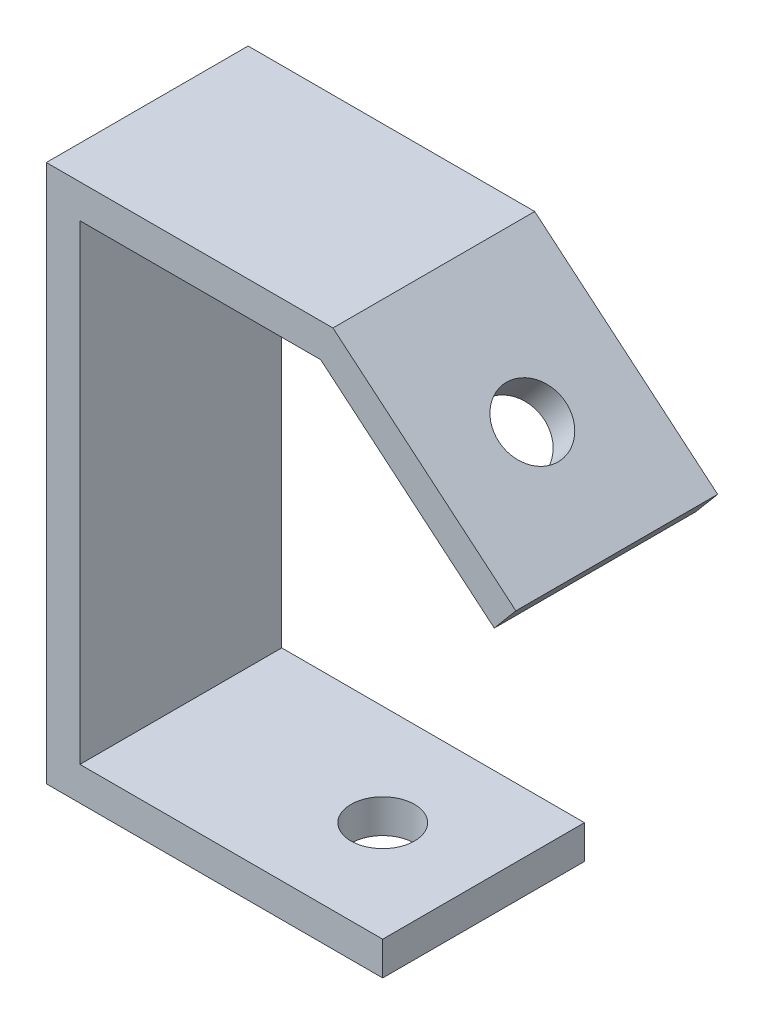
ISO-10303-21;
HEADER;
FILE_DESCRIPTION(('STEP AP214'),'2;1');
FILE_NAME('part.step','',(''),(''),'','','');
FILE_SCHEMA(('AUTOMOTIVE_DESIGN { 1 0 10303 214 1 1 1 1 }'));
ENDSEC;
DATA;
#1=APPLICATION_CONTEXT('core data for automotive mechanical design processes');
#2=APPLICATION_PROTOCOL_DEFINITION('international standard','automotive_design',2000,#1);
#3=PRODUCT_CONTEXT('',#1,'mechanical');
#4=PRODUCT('Part','Part','',(#3));
#5=PRODUCT_RELATED_PRODUCT_CATEGORY('part','',(#4));
#6=PRODUCT_DEFINITION_FORMATION('','',#4);
#7=PRODUCT_DEFINITION_CONTEXT('part definition',#1,'design');
#8=PRODUCT_DEFINITION('design','',#6,#7);
#9=PRODUCT_DEFINITION_SHAPE('','',#8);
#10=(LENGTH_UNIT() NAMED_UNIT(*) SI_UNIT(.MILLI.,.METRE.));
#11=(NAMED_UNIT(*) PLANE_ANGLE_UNIT() SI_UNIT($,.RADIAN.));
#12=(NAMED_UNIT(*) SI_UNIT($,.STERADIAN.) SOLID_ANGLE_UNIT());
#13=UNCERTAINTY_MEASURE_WITH_UNIT(LENGTH_MEASURE(1.E-05),#10,'distance_accuracy_value','');
#14=(GEOMETRIC_REPRESENTATION_CONTEXT(3) GLOBAL_UNCERTAINTY_ASSIGNED_CONTEXT((#13)) GLOBAL_UNIT_ASSIGNED_CONTEXT((#10,
#11,#12)) REPRESENTATION_CONTEXT('',''));
#15=CARTESIAN_POINT('',(0.,0.,0.));
#16=DIRECTION('',(0.,0.,1.));
#17=DIRECTION('',(1.,0.,0.));
#18=AXIS2_PLACEMENT_3D('',#15,#16,#17);
#19=CARTESIAN_POINT('',(0.,61.8433753685089,38.1));
#20=DIRECTION('',(1.,0.,0.));
#21=DIRECTION('',(0.,0.,-1.));
#22=AXIS2_PLACEMENT_3D('',#19,#20,#21);
#23=PLANE('',#22);
#24=DIRECTION('',(0.,-1.,0.));
#25=VECTOR('',#24,1.);
#26=CARTESIAN_POINT('',(0.,61.8433753685089,0.));
#27=LINE('',#26,#25);
#28=CARTESIAN_POINT('',(0.,61.8433753685089,0.));
#29=VERTEX_POINT('',#28);
#30=CARTESIAN_POINT('',(0.,-39.7566246314911,0.));
#31=VERTEX_POINT('',#30);
#32=EDGE_CURVE('E157',#29,#31,#27,.T.);
#33=ORIENTED_EDGE('',*,*,#32,.T.);
#34=DIRECTION('',(0.,0.,-1.));
#35=VECTOR('',#34,1.);
#36=CARTESIAN_POINT('',(0.,-39.7566246314911,38.1));
#37=LINE('',#36,#35);
#38=CARTESIAN_POINT('',(0.,-39.7566246314911,38.1));
#39=VERTEX_POINT('',#38);
#40=EDGE_CURVE('E11',#39,#31,#37,.T.);
#41=ORIENTED_EDGE('',*,*,#40,.F.);
#42=DIRECTION('',(0.,-1.,0.));
#43=VECTOR('',#42,1.);
#44=CARTESIAN_POINT('',(0.,61.8433753685089,38.1));
#45=LINE('',#44,#43);
#46=CARTESIAN_POINT('',(0.,61.8433753685089,38.1));
#47=VERTEX_POINT('',#46);
#48=EDGE_CURVE('E185',#47,#39,#45,.T.);
#49=ORIENTED_EDGE('',*,*,#48,.F.);
#50=DIRECTION('',(0.,0.,-1.));
#51=VECTOR('',#50,1.);
#52=CARTESIAN_POINT('',(0.,61.8433753685089,38.1));
#53=LINE('',#52,#51);
#54=EDGE_CURVE('E153',#47,#29,#53,.T.);
#55=ORIENTED_EDGE('',*,*,#54,.T.);
#56=EDGE_LOOP('',(#33,#41,#49,#55));
#57=FACE_BOUND('',#56,.T.);
#58=ADVANCED_FACE('F43',(#57),#23,.F.);
#59=CARTESIAN_POINT('',(0.,-39.7566246314911,38.1));
#60=DIRECTION('',(0.,1.,0.));
#61=DIRECTION('',(0.,0.,1.));
#62=AXIS2_PLACEMENT_3D('',#59,#60,#61);
#63=PLANE('',#62);
#64=CARTESIAN_POINT('',(44.47,-39.7566246314911,19.05));
#65=DIRECTION('',(0.,-1.,0.));
#66=DIRECTION('',(0.,0.,-1.));
#67=AXIS2_PLACEMENT_3D('',#64,#65,#66);
#68=CIRCLE('',#67,6.);
#69=CARTESIAN_POINT('',(44.47,-39.7566246314911,13.05));
#70=VERTEX_POINT('',#69);
#71=EDGE_CURVE('E248',#70,#70,#68,.T.);
#72=ORIENTED_EDGE('',*,*,#71,.F.);
#73=EDGE_LOOP('',(#72));
#74=FACE_BOUND('',#73,.T.);
#75=DIRECTION('',(1.,0.,0.));
#76=VECTOR('',#75,1.);
#77=CARTESIAN_POINT('',(0.,-39.7566246314911,0.));
#78=LINE('',#77,#76);
#79=CARTESIAN_POINT('',(63.51,-39.7566246314911,0.));
#80=VERTEX_POINT('',#79);
#81=EDGE_CURVE('E161',#31,#80,#78,.T.);
#82=ORIENTED_EDGE('',*,*,#81,.T.);
#83=DIRECTION('',(0.,0.,-1.));
#84=VECTOR('',#83,1.);
#85=CARTESIAN_POINT('',(63.51,-39.7566246314911,38.1));
#86=LINE('',#85,#84);
#87=CARTESIAN_POINT('',(63.51,-39.7566246314911,38.1));
#88=VERTEX_POINT('',#87);
#89=EDGE_CURVE('E53',#88,#80,#86,.T.);
#90=ORIENTED_EDGE('',*,*,#89,.F.);
#91=DIRECTION('',(1.,0.,0.));
#92=VECTOR('',#91,1.);
#93=CARTESIAN_POINT('',(0.,-39.7566246314911,38.1));
#94=LINE('',#93,#92);
#95=EDGE_CURVE('E110',#39,#88,#94,.T.);
#96=ORIENTED_EDGE('',*,*,#95,.F.);
#97=ORIENTED_EDGE('',*,*,#40,.T.);
#98=EDGE_LOOP('',(#82,#90,#96,#97));
#99=FACE_BOUND('',#98,.T.);
#100=ADVANCED_FACE('F275',(#74,#99),#63,.F.);
#101=CARTESIAN_POINT('',(63.51,-39.7566246314911,38.1));
#102=DIRECTION('',(-1.,0.,0.));
#103=DIRECTION('',(0.,0.,1.));
#104=AXIS2_PLACEMENT_3D('',#101,#102,#103);
#105=PLANE('',#104);
#106=DIRECTION('',(0.,1.,0.));
#107=VECTOR('',#106,1.);
#108=CARTESIAN_POINT('',(63.51,-39.7566246314911,0.));
#109=LINE('',#108,#107);
#110=CARTESIAN_POINT('',(63.51,-33.4066246314911,0.));
#111=VERTEX_POINT('',#110);
#112=EDGE_CURVE('E164',#80,#111,#109,.T.);
#113=ORIENTED_EDGE('',*,*,#112,.T.);
#114=DIRECTION('',(0.,0.,-1.));
#115=VECTOR('',#114,1.);
#116=CARTESIAN_POINT('',(63.51,-33.4066246314911,38.1));
#117=LINE('',#116,#115);
#118=CARTESIAN_POINT('',(63.51,-33.4066246314911,38.1));
#119=VERTEX_POINT('',#118);
#120=EDGE_CURVE('E204',#119,#111,#117,.T.);
#121=ORIENTED_EDGE('',*,*,#120,.F.);
#122=DIRECTION('',(0.,1.,0.));
#123=VECTOR('',#122,1.);
#124=CARTESIAN_POINT('',(63.51,-39.7566246314911,38.1));
#125=LINE('',#124,#123);
#126=EDGE_CURVE('E215',#88,#119,#125,.T.);
#127=ORIENTED_EDGE('',*,*,#126,.F.);
#128=ORIENTED_EDGE('',*,*,#89,.T.);
#129=EDGE_LOOP('',(#113,#121,#127,#128));
#130=FACE_BOUND('',#129,.T.);
#131=ADVANCED_FACE('F213',(#130),#105,.F.);
#132=CARTESIAN_POINT('',(63.51,-33.4066246314911,38.1));
#133=DIRECTION('',(0.,-1.,0.));
#134=DIRECTION('',(0.,0.,-1.));
#135=AXIS2_PLACEMENT_3D('',#132,#133,#134);
#136=PLANE('',#135);
#137=CARTESIAN_POINT('',(44.47,-33.4066246314911,19.05));
#138=DIRECTION('',(0.,-1.,0.));
#139=DIRECTION('',(0.,0.,-1.));
#140=AXIS2_PLACEMENT_3D('',#137,#138,#139);
#141=CIRCLE('',#140,6.);
#142=CARTESIAN_POINT('',(44.47,-33.4066246314911,13.05));
#143=VERTEX_POINT('',#142);
#144=EDGE_CURVE('E46',#143,#143,#141,.T.);
#145=ORIENTED_EDGE('',*,*,#144,.T.);
#146=EDGE_LOOP('',(#145));
#147=FACE_BOUND('',#146,.T.);
#148=DIRECTION('',(-1.,0.,0.));
#149=VECTOR('',#148,1.);
#150=CARTESIAN_POINT('',(63.51,-33.4066246314911,0.));
#151=LINE('',#150,#149);
#152=CARTESIAN_POINT('',(6.35,-33.4066246314911,0.));
#153=VERTEX_POINT('',#152);
#154=EDGE_CURVE('E167',#111,#153,#151,.T.);
#155=ORIENTED_EDGE('',*,*,#154,.T.);
#156=DIRECTION('',(0.,0.,-1.));
#157=VECTOR('',#156,1.);
#158=CARTESIAN_POINT('',(6.35,-33.4066246314911,38.1));
#159=LINE('',#158,#157);
#160=CARTESIAN_POINT('',(6.35,-33.4066246314911,38.1));
#161=VERTEX_POINT('',#160);
#162=EDGE_CURVE('E200',#161,#153,#159,.T.);
#163=ORIENTED_EDGE('',*,*,#162,.F.);
#164=DIRECTION('',(-1.,0.,0.));
#165=VECTOR('',#164,1.);
#166=CARTESIAN_POINT('',(63.51,-33.4066246314911,38.1));
#167=LINE('',#166,#165);
#168=EDGE_CURVE('E234',#119,#161,#167,.T.);
#169=ORIENTED_EDGE('',*,*,#168,.F.);
#170=ORIENTED_EDGE('',*,*,#120,.T.);
#171=EDGE_LOOP('',(#155,#163,#169,#170));
#172=FACE_BOUND('',#171,.T.);
#173=ADVANCED_FACE('F224',(#147,#172),#136,.F.);
#174=CARTESIAN_POINT('',(6.35,-33.4066246314911,38.1));
#175=DIRECTION('',(-1.,0.,0.));
#176=DIRECTION('',(0.,0.,1.));
#177=AXIS2_PLACEMENT_3D('',#174,#175,#176);
#178=PLANE('',#177);
#179=DIRECTION('',(0.,1.,0.));
#180=VECTOR('',#179,1.);
#181=CARTESIAN_POINT('',(6.35,-33.4066246314911,0.));
#182=LINE('',#181,#180);
#183=CARTESIAN_POINT('',(6.35,55.4933753685089,0.));
#184=VERTEX_POINT('',#183);
#185=EDGE_CURVE('E170',#153,#184,#182,.T.);
#186=ORIENTED_EDGE('',*,*,#185,.T.);
#187=DIRECTION('',(0.,0.,-1.));
#188=VECTOR('',#187,1.);
#189=CARTESIAN_POINT('',(6.35,55.4933753685089,38.1));
#190=LINE('',#189,#188);
#191=CARTESIAN_POINT('',(6.35,55.4933753685089,38.1));
#192=VERTEX_POINT('',#191);
#193=EDGE_CURVE('E196',#192,#184,#190,.T.);
#194=ORIENTED_EDGE('',*,*,#193,.F.);
#195=DIRECTION('',(0.,1.,0.));
#196=VECTOR('',#195,1.);
#197=CARTESIAN_POINT('',(6.35,-33.4066246314911,38.1));
#198=LINE('',#197,#196);
#199=EDGE_CURVE('E230',#161,#192,#198,.T.);
#200=ORIENTED_EDGE('',*,*,#199,.F.);
#201=ORIENTED_EDGE('',*,*,#162,.T.);
#202=EDGE_LOOP('',(#186,#194,#200,#201));
#203=FACE_BOUND('',#202,.T.);
#204=ADVANCED_FACE('F228',(#203),#178,.F.);
#205=CARTESIAN_POINT('',(6.35,55.4933753685089,38.1));
#206=DIRECTION('',(0.,1.,0.));
#207=DIRECTION('',(-1.,0.,0.));
#208=AXIS2_PLACEMENT_3D('',#205,#206,#207);
#209=PLANE('',#208);
#210=DIRECTION('',(1.,0.,0.));
#211=VECTOR('',#210,1.);
#212=CARTESIAN_POINT('',(6.35,55.4933753685089,0.));
#213=LINE('',#212,#211);
#214=CARTESIAN_POINT('',(51.8087890124096,55.4933753685089,0.));
#215=VERTEX_POINT('',#214);
#216=EDGE_CURVE('E173',#184,#215,#213,.T.);
#217=ORIENTED_EDGE('',*,*,#216,.T.);
#218=DIRECTION('',(0.,0.,-1.));
#219=VECTOR('',#218,1.);
#220=CARTESIAN_POINT('',(51.8087890124096,55.4933753685089,38.1));
#221=LINE('',#220,#219);
#222=CARTESIAN_POINT('',(51.8087890124096,55.4933753685089,38.1));
#223=VERTEX_POINT('',#222);
#224=EDGE_CURVE('E192',#223,#215,#221,.T.);
#225=ORIENTED_EDGE('',*,*,#224,.F.);
#226=DIRECTION('',(1.,0.,0.));
#227=VECTOR('',#226,1.);
#228=CARTESIAN_POINT('',(6.35,55.4933753685089,38.1));
#229=LINE('',#228,#227);
#230=EDGE_CURVE('E233',#192,#223,#229,.T.);
#231=ORIENTED_EDGE('',*,*,#230,.F.);
#232=ORIENTED_EDGE('',*,*,#193,.T.);
#233=EDGE_LOOP('',(#217,#225,#231,#232));
#234=FACE_BOUND('',#233,.T.);
#235=ADVANCED_FACE('F287',(#234),#209,.F.);
#236=CARTESIAN_POINT('',(51.8087890124096,55.4933753685089,38.1));
#237=DIRECTION('',(0.642787609686541,0.766044443118977,0.));
#238=DIRECTION('',(-0.766044443118977,0.642787609686541,0.));
#239=AXIS2_PLACEMENT_3D('',#236,#237,#238);
#240=PLANE('',#239);
#241=CARTESIAN_POINT('',(68.6378577574192,41.3721099915142,19.05));
#242=DIRECTION('',(0.642787609686541,0.766044443118977,0.));
#243=DIRECTION('',(-0.766044443118977,0.642787609686541,0.));
#244=AXIS2_PLACEMENT_3D('',#241,#242,#243);
#245=CIRCLE('',#244,6.35820536132282);
#246=CARTESIAN_POINT('',(63.7671898721686,45.4590856176151,19.05));
#247=VERTEX_POINT('',#246);
#248=EDGE_CURVE('E252',#247,#247,#245,.T.);
#249=ORIENTED_EDGE('',*,*,#248,.T.);
#250=EDGE_LOOP('',(#249));
#251=FACE_BOUND('',#250,.T.);
#252=DIRECTION('',(0.766044443118977,-0.642787609686541,0.));
#253=VECTOR('',#252,1.);
#254=CARTESIAN_POINT('',(51.8087890124096,55.4933753685089,0.));
#255=LINE('',#254,#253);
#256=CARTESIAN_POINT('',(84.5792426187251,27.9956998339373,0.));
#257=VERTEX_POINT('',#256);
#258=EDGE_CURVE('E176',#215,#257,#255,.T.);
#259=ORIENTED_EDGE('',*,*,#258,.T.);
#260=DIRECTION('',(0.,0.,-1.));
#261=VECTOR('',#260,1.);
#262=CARTESIAN_POINT('',(84.5792426187251,27.9956998339373,38.1));
#263=LINE('',#262,#261);
#264=CARTESIAN_POINT('',(84.5792426187251,27.9956998339373,38.1));
#265=VERTEX_POINT('',#264);
#266=EDGE_CURVE('E146',#265,#257,#263,.T.);
#267=ORIENTED_EDGE('',*,*,#266,.F.);
#268=DIRECTION('',(0.766044443118977,-0.642787609686541,0.));
#269=VECTOR('',#268,1.);
#270=CARTESIAN_POINT('',(51.8087890124096,55.4933753685089,38.1));
#271=LINE('',#270,#269);
#272=EDGE_CURVE('E135',#223,#265,#271,.T.);
#273=ORIENTED_EDGE('',*,*,#272,.F.);
#274=ORIENTED_EDGE('',*,*,#224,.T.);
#275=EDGE_LOOP('',(#259,#267,#273,#274));
#276=FACE_BOUND('',#275,.T.);
#277=ADVANCED_FACE('F272',(#251,#276),#240,.F.);
#278=CARTESIAN_POINT('',(88.6609439402347,32.8600820477428,38.1));
#279=DIRECTION('',(-0.766044443118977,0.64278760968654,0.));
#280=DIRECTION('',(-0.64278760968654,-0.766044443118977,0.));
#281=AXIS2_PLACEMENT_3D('',#278,#279,#280);
#282=PLANE('',#281);
#283=DIRECTION('',(0.64278760968654,0.766044443118977,0.));
#284=VECTOR('',#283,1.);
#285=CARTESIAN_POINT('',(88.6609439402347,32.8600820477428,0.));
#286=LINE('',#285,#284);
#287=CARTESIAN_POINT('',(88.6609439402347,32.8600820477428,0.));
#288=VERTEX_POINT('',#287);
#289=EDGE_CURVE('E144',#257,#288,#286,.T.);
#290=ORIENTED_EDGE('',*,*,#289,.T.);
#291=DIRECTION('',(0.,0.,-1.));
#292=VECTOR('',#291,1.);
#293=CARTESIAN_POINT('',(88.6609439402347,32.8600820477428,38.1));
#294=LINE('',#293,#292);
#295=CARTESIAN_POINT('',(88.6609439402347,32.8600820477428,38.1));
#296=VERTEX_POINT('',#295);
#297=EDGE_CURVE('E141',#296,#288,#294,.T.);
#298=ORIENTED_EDGE('',*,*,#297,.F.);
#299=DIRECTION('',(0.64278760968654,0.766044443118977,0.));
#300=VECTOR('',#299,1.);
#301=CARTESIAN_POINT('',(88.6609439402347,32.8600820477428,38.1));
#302=LINE('',#301,#300);
#303=EDGE_CURVE('E129',#265,#296,#302,.T.);
#304=ORIENTED_EDGE('',*,*,#303,.F.);
#305=ORIENTED_EDGE('',*,*,#266,.T.);
#306=EDGE_LOOP('',(#290,#298,#304,#305));
#307=FACE_BOUND('',#306,.T.);
#308=ADVANCED_FACE('F142',(#307),#282,.F.);
#309=CARTESIAN_POINT('',(54.12,61.8433753685089,38.1));
#310=DIRECTION('',(-0.642787609686541,-0.766044443118977,0.));
#311=DIRECTION('',(0.766044443118977,-0.642787609686541,0.));
#312=AXIS2_PLACEMENT_3D('',#309,#310,#311);
#313=PLANE('',#312);
#314=CARTESIAN_POINT('',(72.7195590789288,46.2364922053197,19.05));
#315=DIRECTION('',(0.642787609686541,0.766044443118977,0.));
#316=DIRECTION('',(-0.766044443118977,0.642787609686541,0.));
#317=AXIS2_PLACEMENT_3D('',#314,#315,#316);
#318=CIRCLE('',#317,6.35820536132282);
#319=CARTESIAN_POINT('',(67.8488911936781,50.3234678314206,19.05));
#320=VERTEX_POINT('',#319);
#321=EDGE_CURVE('E256',#320,#320,#318,.T.);
#322=ORIENTED_EDGE('',*,*,#321,.F.);
#323=EDGE_LOOP('',(#322));
#324=FACE_BOUND('',#323,.T.);
#325=DIRECTION('',(-0.766044443118977,0.642787609686541,0.));
#326=VECTOR('',#325,1.);
#327=CARTESIAN_POINT('',(54.12,61.8433753685089,0.));
#328=LINE('',#327,#326);
#329=CARTESIAN_POINT('',(54.12,61.8433753685089,0.));
#330=VERTEX_POINT('',#329);
#331=EDGE_CURVE('E96',#288,#330,#328,.T.);
#332=ORIENTED_EDGE('',*,*,#331,.T.);
#333=DIRECTION('',(0.,0.,-1.));
#334=VECTOR('',#333,1.);
#335=CARTESIAN_POINT('',(54.12,61.8433753685089,38.1));
#336=LINE('',#335,#334);
#337=CARTESIAN_POINT('',(54.12,61.8433753685089,38.1));
#338=VERTEX_POINT('',#337);
#339=EDGE_CURVE('E147',#338,#330,#336,.T.);
#340=ORIENTED_EDGE('',*,*,#339,.F.);
#341=DIRECTION('',(-0.766044443118977,0.642787609686541,0.));
#342=VECTOR('',#341,1.);
#343=CARTESIAN_POINT('',(54.12,61.8433753685089,38.1));
#344=LINE('',#343,#342);
#345=EDGE_CURVE('E133',#296,#338,#344,.T.);
#346=ORIENTED_EDGE('',*,*,#345,.F.);
#347=ORIENTED_EDGE('',*,*,#297,.T.);
#348=EDGE_LOOP('',(#332,#340,#346,#347));
#349=FACE_BOUND('',#348,.T.);
#350=ADVANCED_FACE('F149',(#324,#349),#313,.F.);
#351=CARTESIAN_POINT('',(0.,61.8433753685089,38.1));
#352=DIRECTION('',(0.,-1.,0.));
#353=DIRECTION('',(0.,0.,-1.));
#354=AXIS2_PLACEMENT_3D('',#351,#352,#353);
#355=PLANE('',#354);
#356=DIRECTION('',(-1.,0.,0.));
#357=VECTOR('',#356,1.);
#358=CARTESIAN_POINT('',(0.,61.8433753685089,0.));
#359=LINE('',#358,#357);
#360=EDGE_CURVE('E102',#330,#29,#359,.T.);
#361=ORIENTED_EDGE('',*,*,#360,.T.);
#362=ORIENTED_EDGE('',*,*,#54,.F.);
#363=DIRECTION('',(-1.,0.,0.));
#364=VECTOR('',#363,1.);
#365=CARTESIAN_POINT('',(0.,61.8433753685089,38.1));
#366=LINE('',#365,#364);
#367=EDGE_CURVE('E61',#338,#47,#366,.T.);
#368=ORIENTED_EDGE('',*,*,#367,.F.);
#369=ORIENTED_EDGE('',*,*,#339,.T.);
#370=EDGE_LOOP('',(#361,#362,#368,#369));
#371=FACE_BOUND('',#370,.T.);
#372=ADVANCED_FACE('F265',(#371),#355,.F.);
#373=CARTESIAN_POINT('',(0.,0.,38.1));
#374=DIRECTION('',(0.,0.,1.));
#375=DIRECTION('',(1.,0.,0.));
#376=AXIS2_PLACEMENT_3D('',#373,#374,#375);
#377=PLANE('',#376);
#378=ORIENTED_EDGE('',*,*,#48,.T.);
#379=ORIENTED_EDGE('',*,*,#95,.T.);
#380=ORIENTED_EDGE('',*,*,#126,.T.);
#381=ORIENTED_EDGE('',*,*,#168,.T.);
#382=ORIENTED_EDGE('',*,*,#199,.T.);
#383=ORIENTED_EDGE('',*,*,#230,.T.);
#384=ORIENTED_EDGE('',*,*,#272,.T.);
#385=ORIENTED_EDGE('',*,*,#303,.T.);
#386=ORIENTED_EDGE('',*,*,#345,.T.);
#387=ORIENTED_EDGE('',*,*,#367,.T.);
#388=EDGE_LOOP('',(#378,#379,#380,#381,#382,#383,#384,#385,#386,#387));
#389=FACE_BOUND('',#388,.T.);
#390=ADVANCED_FACE('F131',(#389),#377,.T.);
#391=CARTESIAN_POINT('',(0.,0.,0.));
#392=DIRECTION('',(0.,0.,1.));
#393=DIRECTION('',(1.,0.,0.));
#394=AXIS2_PLACEMENT_3D('',#391,#392,#393);
#395=PLANE('',#394);
#396=ORIENTED_EDGE('',*,*,#32,.F.);
#397=ORIENTED_EDGE('',*,*,#360,.F.);
#398=ORIENTED_EDGE('',*,*,#331,.F.);
#399=ORIENTED_EDGE('',*,*,#289,.F.);
#400=ORIENTED_EDGE('',*,*,#258,.F.);
#401=ORIENTED_EDGE('',*,*,#216,.F.);
#402=ORIENTED_EDGE('',*,*,#185,.F.);
#403=ORIENTED_EDGE('',*,*,#154,.F.);
#404=ORIENTED_EDGE('',*,*,#112,.F.);
#405=ORIENTED_EDGE('',*,*,#81,.F.);
#406=EDGE_LOOP('',(#396,#397,#398,#399,#400,#401,#402,#403,#404,#405));
#407=FACE_BOUND('',#406,.T.);
#408=ADVANCED_FACE('F219',(#407),#395,.F.);
#409=CARTESIAN_POINT('',(44.47,-16.6566246314911,19.05));
#410=DIRECTION('',(0.,-1.,0.));
#411=DIRECTION('',(0.,0.,-1.));
#412=AXIS2_PLACEMENT_3D('',#409,#410,#411);
#413=CYLINDRICAL_SURFACE('',#412,6.);
#414=ORIENTED_EDGE('',*,*,#71,.T.);
#415=EDGE_LOOP('',(#414));
#416=FACE_BOUND('',#415,.T.);
#417=ORIENTED_EDGE('',*,*,#144,.F.);
#418=EDGE_LOOP('',(#417));
#419=FACE_BOUND('',#418,.T.);
#420=ADVANCED_FACE('F354',(#416,#419),#413,.F.);
#421=CARTESIAN_POINT('',(57.8711652951697,28.5408655692714,19.05));
#422=DIRECTION('',(0.642787609686541,0.766044443118977,0.));
#423=DIRECTION('',(-0.766044443118977,0.642787609686541,0.));
#424=AXIS2_PLACEMENT_3D('',#421,#422,#423);
#425=CYLINDRICAL_SURFACE('',#424,6.35820536132282);
#426=ORIENTED_EDGE('',*,*,#321,.T.);
#427=EDGE_LOOP('',(#426));
#428=FACE_BOUND('',#427,.T.);
#429=ORIENTED_EDGE('',*,*,#248,.F.);
#430=EDGE_LOOP('',(#429));
#431=FACE_BOUND('',#430,.T.);
#432=ADVANCED_FACE('F261',(#428,#431),#425,.F.);
#433=CLOSED_SHELL('',(#58,#100,#131,#173,#204,#235,#277,#308,#350,#372,#390,#408,#420,#432));
#434=MANIFOLD_SOLID_BREP('B2',#433);
#435=ADVANCED_BREP_SHAPE_REPRESENTATION('',(#18,#434),#14);
#436=SHAPE_DEFINITION_REPRESENTATION(#9,#435);
ENDSEC;
END-ISO-10303-21;
